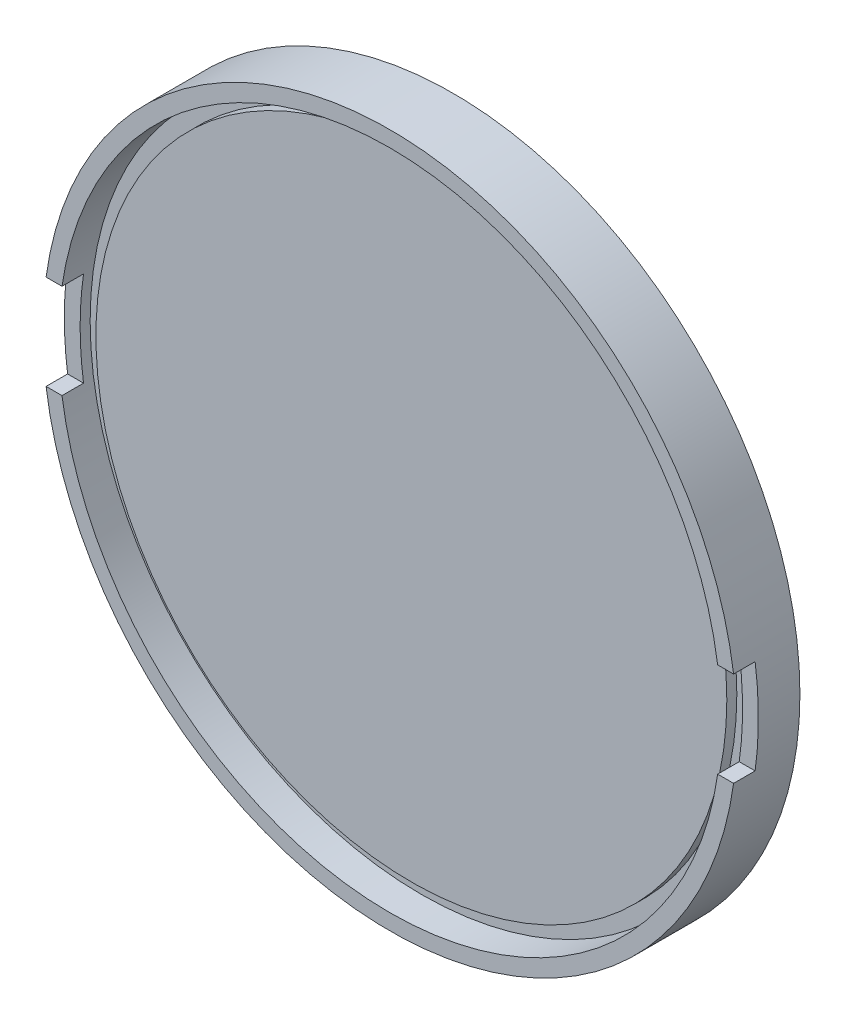
ISO-10303-21;
HEADER;
FILE_DESCRIPTION(('STEP AP214'),'2;1');
FILE_NAME('part.step','',(''),(''),'','','');
FILE_SCHEMA(('AUTOMOTIVE_DESIGN { 1 0 10303 214 1 1 1 1 }'));
ENDSEC;
DATA;
#1=APPLICATION_CONTEXT('core data for automotive mechanical design processes');
#2=APPLICATION_PROTOCOL_DEFINITION('international standard','automotive_design',2000,#1);
#3=PRODUCT_CONTEXT('',#1,'mechanical');
#4=PRODUCT('Part','Part','',(#3));
#5=PRODUCT_RELATED_PRODUCT_CATEGORY('part','',(#4));
#6=PRODUCT_DEFINITION_FORMATION('','',#4);
#7=PRODUCT_DEFINITION_CONTEXT('part definition',#1,'design');
#8=PRODUCT_DEFINITION('design','',#6,#7);
#9=PRODUCT_DEFINITION_SHAPE('','',#8);
#10=(LENGTH_UNIT() NAMED_UNIT(*) SI_UNIT(.MILLI.,.METRE.));
#11=(NAMED_UNIT(*) PLANE_ANGLE_UNIT() SI_UNIT($,.RADIAN.));
#12=(NAMED_UNIT(*) SI_UNIT($,.STERADIAN.) SOLID_ANGLE_UNIT());
#13=UNCERTAINTY_MEASURE_WITH_UNIT(LENGTH_MEASURE(1.E-05),#10,'distance_accuracy_value','');
#14=(GEOMETRIC_REPRESENTATION_CONTEXT(3) GLOBAL_UNCERTAINTY_ASSIGNED_CONTEXT((#13)) GLOBAL_UNIT_ASSIGNED_CONTEXT((#10,
#11,#12)) REPRESENTATION_CONTEXT('',''));
#15=CARTESIAN_POINT('',(0.,0.,0.));
#16=DIRECTION('',(0.,0.,1.));
#17=DIRECTION('',(1.,0.,0.));
#18=AXIS2_PLACEMENT_3D('',#15,#16,#17);
#19=CARTESIAN_POINT('',(0.,0.,10.));
#20=DIRECTION('',(0.,0.,-1.));
#21=DIRECTION('',(-1.,0.,0.));
#22=AXIS2_PLACEMENT_3D('',#19,#20,#21);
#23=PLANE('',#22);
#24=DIRECTION('',(1.,0.,0.));
#25=VECTOR('',#24,1.);
#26=CARTESIAN_POINT('',(-110.,-15.,10.));
#27=LINE('',#26,#25);
#28=CARTESIAN_POINT('',(-108.972473588517,-15.,10.));
#29=VERTEX_POINT('',#28);
#30=CARTESIAN_POINT('',(-103.923048454133,-15.,10.));
#31=VERTEX_POINT('',#30);
#32=EDGE_CURVE('E81',#29,#31,#27,.T.);
#33=ORIENTED_EDGE('',*,*,#32,.F.);
#34=CARTESIAN_POINT('',(0.,0.,10.));
#35=DIRECTION('',(0.,0.,-1.));
#36=DIRECTION('',(-1.,0.,0.));
#37=AXIS2_PLACEMENT_3D('',#34,#35,#36);
#38=CIRCLE('',#37,110.);
#39=CARTESIAN_POINT('',(108.972473588517,-15.,10.));
#40=VERTEX_POINT('',#39);
#41=EDGE_CURVE('E149',#40,#29,#38,.T.);
#42=ORIENTED_EDGE('',*,*,#41,.F.);
#43=CARTESIAN_POINT('',(103.923048454133,-15.,10.));
#44=VERTEX_POINT('',#43);
#45=EDGE_CURVE('E213',#44,#40,#27,.T.);
#46=ORIENTED_EDGE('',*,*,#45,.F.);
#47=CARTESIAN_POINT('',(0.,0.,10.));
#48=DIRECTION('',(0.,0.,-1.));
#49=DIRECTION('',(-1.,0.,0.));
#50=AXIS2_PLACEMENT_3D('',#47,#48,#49);
#51=CIRCLE('',#50,105.);
#52=EDGE_CURVE('E177',#44,#31,#51,.T.);
#53=ORIENTED_EDGE('',*,*,#52,.T.);
#54=EDGE_LOOP('',(#33,#42,#46,#53));
#55=FACE_BOUND('',#54,.T.);
#56=ADVANCED_FACE('F57',(#55),#23,.F.);
#57=CARTESIAN_POINT('',(0.,0.,10.));
#58=DIRECTION('',(0.,0.,-1.));
#59=DIRECTION('',(-1.,0.,0.));
#60=AXIS2_PLACEMENT_3D('',#57,#58,#59);
#61=CYLINDRICAL_SURFACE('',#60,110.);
#62=CARTESIAN_POINT('',(0.,0.,3.17499999999999));
#63=DIRECTION('',(0.,0.,-1.));
#64=DIRECTION('',(-1.,0.,0.));
#65=AXIS2_PLACEMENT_3D('',#62,#63,#64);
#66=CIRCLE('',#65,110.);
#67=CARTESIAN_POINT('',(108.972473588517,-15.,3.17499999999999));
#68=VERTEX_POINT('',#67);
#69=CARTESIAN_POINT('',(108.972473588517,15.,3.17499999999999));
#70=VERTEX_POINT('',#69);
#71=EDGE_CURVE('E135',#68,#70,#66,.F.);
#72=ORIENTED_EDGE('',*,*,#71,.F.);
#73=DIRECTION('',(0.,0.,-1.));
#74=VECTOR('',#73,1.);
#75=CARTESIAN_POINT('',(108.972473588517,-15.,10.));
#76=LINE('',#75,#74);
#77=EDGE_CURVE('E136',#68,#40,#76,.F.);
#78=ORIENTED_EDGE('',*,*,#77,.T.);
#79=ORIENTED_EDGE('',*,*,#41,.T.);
#80=DIRECTION('',(0.,0.,-1.));
#81=VECTOR('',#80,1.);
#82=CARTESIAN_POINT('',(-108.972473588517,-15.,10.));
#83=LINE('',#82,#81);
#84=CARTESIAN_POINT('',(-108.972473588517,-15.,3.17499999999999));
#85=VERTEX_POINT('',#84);
#86=EDGE_CURVE('E139',#29,#85,#83,.T.);
#87=ORIENTED_EDGE('',*,*,#86,.T.);
#88=CARTESIAN_POINT('',(-108.972473588517,15.,3.17499999999999));
#89=VERTEX_POINT('',#88);
#90=EDGE_CURVE('E123',#89,#85,#66,.F.);
#91=ORIENTED_EDGE('',*,*,#90,.F.);
#92=DIRECTION('',(0.,0.,-1.));
#93=VECTOR('',#92,1.);
#94=CARTESIAN_POINT('',(-108.972473588517,15.,10.));
#95=LINE('',#94,#93);
#96=CARTESIAN_POINT('',(-108.972473588517,15.,10.));
#97=VERTEX_POINT('',#96);
#98=EDGE_CURVE('E162',#97,#89,#95,.T.);
#99=ORIENTED_EDGE('',*,*,#98,.F.);
#100=CARTESIAN_POINT('',(108.972473588517,15.,10.));
#101=VERTEX_POINT('',#100);
#102=EDGE_CURVE('E183',#97,#101,#38,.T.);
#103=ORIENTED_EDGE('',*,*,#102,.T.);
#104=DIRECTION('',(0.,0.,-1.));
#105=VECTOR('',#104,1.);
#106=CARTESIAN_POINT('',(108.972473588517,15.,10.));
#107=LINE('',#106,#105);
#108=EDGE_CURVE('E165',#70,#101,#107,.F.);
#109=ORIENTED_EDGE('',*,*,#108,.F.);
#110=EDGE_LOOP('',(#72,#78,#79,#87,#91,#99,#103,#109));
#111=FACE_BOUND('',#110,.T.);
#112=CARTESIAN_POINT('',(0.,0.,-10.));
#113=DIRECTION('',(0.,0.,-1.));
#114=DIRECTION('',(-1.,0.,0.));
#115=AXIS2_PLACEMENT_3D('',#112,#113,#114);
#116=CIRCLE('',#115,110.);
#117=CARTESIAN_POINT('',(-110.,0.,-10.));
#118=VERTEX_POINT('',#117);
#119=EDGE_CURVE('E168',#118,#118,#116,.T.);
#120=ORIENTED_EDGE('',*,*,#119,.F.);
#121=EDGE_LOOP('',(#120));
#122=FACE_BOUND('',#121,.T.);
#123=ADVANCED_FACE('F59',(#111,#122),#61,.T.);
#124=ORIENTED_EDGE('',*,*,#102,.F.);
#125=DIRECTION('',(1.,0.,0.));
#126=VECTOR('',#125,1.);
#127=CARTESIAN_POINT('',(-110.,15.,10.));
#128=LINE('',#127,#126);
#129=CARTESIAN_POINT('',(-103.923048454133,15.,10.));
#130=VERTEX_POINT('',#129);
#131=EDGE_CURVE('E151',#97,#130,#128,.T.);
#132=ORIENTED_EDGE('',*,*,#131,.T.);
#133=CARTESIAN_POINT('',(103.923048454133,15.,10.));
#134=VERTEX_POINT('',#133);
#135=EDGE_CURVE('E173',#130,#134,#51,.T.);
#136=ORIENTED_EDGE('',*,*,#135,.T.);
#137=EDGE_CURVE('E157',#134,#101,#128,.T.);
#138=ORIENTED_EDGE('',*,*,#137,.T.);
#139=EDGE_LOOP('',(#124,#132,#136,#138));
#140=FACE_BOUND('',#139,.T.);
#141=ADVANCED_FACE('F225',(#140),#23,.F.);
#142=CARTESIAN_POINT('',(0.,0.,10.));
#143=DIRECTION('',(0.,0.,-1.));
#144=DIRECTION('',(-1.,0.,0.));
#145=AXIS2_PLACEMENT_3D('',#142,#143,#144);
#146=CYLINDRICAL_SURFACE('',#145,105.);
#147=CARTESIAN_POINT('',(0.,0.,3.17499999999999));
#148=DIRECTION('',(0.,0.,-1.));
#149=DIRECTION('',(-1.,0.,0.));
#150=AXIS2_PLACEMENT_3D('',#147,#148,#149);
#151=CIRCLE('',#150,105.);
#152=CARTESIAN_POINT('',(103.923048454133,-15.,3.17499999999999));
#153=VERTEX_POINT('',#152);
#154=CARTESIAN_POINT('',(103.923048454133,15.,3.17499999999999));
#155=VERTEX_POINT('',#154);
#156=EDGE_CURVE('E66',#153,#155,#151,.F.);
#157=ORIENTED_EDGE('',*,*,#156,.T.);
#158=DIRECTION('',(0.,0.,-1.));
#159=VECTOR('',#158,1.);
#160=CARTESIAN_POINT('',(103.923048454133,15.,10.));
#161=LINE('',#160,#159);
#162=EDGE_CURVE('E12',#155,#134,#161,.F.);
#163=ORIENTED_EDGE('',*,*,#162,.T.);
#164=ORIENTED_EDGE('',*,*,#135,.F.);
#165=DIRECTION('',(0.,0.,-1.));
#166=VECTOR('',#165,1.);
#167=CARTESIAN_POINT('',(-103.923048454133,15.,10.));
#168=LINE('',#167,#166);
#169=CARTESIAN_POINT('',(-103.923048454133,15.,3.17499999999999));
#170=VERTEX_POINT('',#169);
#171=EDGE_CURVE('E189',#130,#170,#168,.T.);
#172=ORIENTED_EDGE('',*,*,#171,.T.);
#173=CARTESIAN_POINT('',(-103.923048454133,-15.,3.17499999999999));
#174=VERTEX_POINT('',#173);
#175=EDGE_CURVE('E186',#170,#174,#151,.F.);
#176=ORIENTED_EDGE('',*,*,#175,.T.);
#177=DIRECTION('',(0.,0.,-1.));
#178=VECTOR('',#177,1.);
#179=CARTESIAN_POINT('',(-103.923048454133,-15.,10.));
#180=LINE('',#179,#178);
#181=EDGE_CURVE('E140',#31,#174,#180,.T.);
#182=ORIENTED_EDGE('',*,*,#181,.F.);
#183=ORIENTED_EDGE('',*,*,#52,.F.);
#184=DIRECTION('',(0.,0.,-1.));
#185=VECTOR('',#184,1.);
#186=CARTESIAN_POINT('',(103.923048454133,-15.,10.));
#187=LINE('',#186,#185);
#188=EDGE_CURVE('E192',#153,#44,#187,.F.);
#189=ORIENTED_EDGE('',*,*,#188,.F.);
#190=EDGE_LOOP('',(#157,#163,#164,#172,#176,#182,#183,#189));
#191=FACE_BOUND('',#190,.T.);
#192=CARTESIAN_POINT('',(0.,0.,0.));
#193=DIRECTION('',(0.,0.,-1.));
#194=DIRECTION('',(-1.,0.,0.));
#195=AXIS2_PLACEMENT_3D('',#192,#193,#194);
#196=CIRCLE('',#195,105.);
#197=CARTESIAN_POINT('',(-105.,0.,0.));
#198=VERTEX_POINT('',#197);
#199=EDGE_CURVE('E172',#198,#198,#196,.T.);
#200=ORIENTED_EDGE('',*,*,#199,.T.);
#201=EDGE_LOOP('',(#200));
#202=FACE_BOUND('',#201,.T.);
#203=ADVANCED_FACE('F199',(#191,#202),#146,.F.);
#204=CARTESIAN_POINT('',(0.,0.,0.));
#205=DIRECTION('',(0.,0.,-1.));
#206=DIRECTION('',(-1.,0.,0.));
#207=AXIS2_PLACEMENT_3D('',#204,#205,#206);
#208=PLANE('',#207);
#209=ORIENTED_EDGE('',*,*,#199,.F.);
#210=EDGE_LOOP('',(#209));
#211=FACE_BOUND('',#210,.T.);
#212=ADVANCED_FACE('F248',(#211),#208,.F.);
#213=CARTESIAN_POINT('',(0.,0.,-10.));
#214=DIRECTION('',(0.,0.,-1.));
#215=DIRECTION('',(-1.,0.,0.));
#216=AXIS2_PLACEMENT_3D('',#213,#214,#215);
#217=PLANE('',#216);
#218=ORIENTED_EDGE('',*,*,#119,.T.);
#219=EDGE_LOOP('',(#218));
#220=FACE_BOUND('',#219,.T.);
#221=ADVANCED_FACE('F253',(#220),#217,.T.);
#222=CARTESIAN_POINT('',(-110.,-15.,3.17499999999999));
#223=DIRECTION('',(0.,1.,0.));
#224=DIRECTION('',(0.,0.,1.));
#225=AXIS2_PLACEMENT_3D('',#222,#223,#224);
#226=PLANE('',#225);
#227=ORIENTED_EDGE('',*,*,#32,.T.);
#228=ORIENTED_EDGE('',*,*,#181,.T.);
#229=DIRECTION('',(1.,0.,0.));
#230=VECTOR('',#229,1.);
#231=CARTESIAN_POINT('',(-110.,-15.,3.17499999999999));
#232=LINE('',#231,#230);
#233=EDGE_CURVE('E126',#85,#174,#232,.T.);
#234=ORIENTED_EDGE('',*,*,#233,.F.);
#235=ORIENTED_EDGE('',*,*,#86,.F.);
#236=EDGE_LOOP('',(#227,#228,#234,#235));
#237=FACE_BOUND('',#236,.T.);
#238=ADVANCED_FACE('F138',(#237),#226,.T.);
#239=CARTESIAN_POINT('',(-110.,-15.,3.17499999999999));
#240=DIRECTION('',(0.,0.,-1.));
#241=DIRECTION('',(-1.,0.,0.));
#242=AXIS2_PLACEMENT_3D('',#239,#240,#241);
#243=PLANE('',#242);
#244=ORIENTED_EDGE('',*,*,#90,.T.);
#245=ORIENTED_EDGE('',*,*,#233,.T.);
#246=ORIENTED_EDGE('',*,*,#175,.F.);
#247=DIRECTION('',(1.,0.,0.));
#248=VECTOR('',#247,1.);
#249=CARTESIAN_POINT('',(-110.,15.,3.17499999999999));
#250=LINE('',#249,#248);
#251=EDGE_CURVE('E129',#89,#170,#250,.T.);
#252=ORIENTED_EDGE('',*,*,#251,.F.);
#253=EDGE_LOOP('',(#244,#245,#246,#252));
#254=FACE_BOUND('',#253,.T.);
#255=ADVANCED_FACE('F125',(#254),#243,.F.);
#256=CARTESIAN_POINT('',(-110.,15.,3.17499999999999));
#257=DIRECTION('',(0.,1.,0.));
#258=DIRECTION('',(0.,0.,1.));
#259=AXIS2_PLACEMENT_3D('',#256,#257,#258);
#260=PLANE('',#259);
#261=ORIENTED_EDGE('',*,*,#98,.T.);
#262=ORIENTED_EDGE('',*,*,#251,.T.);
#263=ORIENTED_EDGE('',*,*,#171,.F.);
#264=ORIENTED_EDGE('',*,*,#131,.F.);
#265=EDGE_LOOP('',(#261,#262,#263,#264));
#266=FACE_BOUND('',#265,.T.);
#267=ADVANCED_FACE('F229',(#266),#260,.F.);
#268=ORIENTED_EDGE('',*,*,#108,.T.);
#269=ORIENTED_EDGE('',*,*,#137,.F.);
#270=ORIENTED_EDGE('',*,*,#162,.F.);
#271=EDGE_CURVE('E142',#155,#70,#250,.T.);
#272=ORIENTED_EDGE('',*,*,#271,.T.);
#273=EDGE_LOOP('',(#268,#269,#270,#272));
#274=FACE_BOUND('',#273,.T.);
#275=ADVANCED_FACE('F227',(#274),#260,.F.);
#276=ORIENTED_EDGE('',*,*,#71,.T.);
#277=ORIENTED_EDGE('',*,*,#271,.F.);
#278=ORIENTED_EDGE('',*,*,#156,.F.);
#279=EDGE_CURVE('E73',#153,#68,#232,.T.);
#280=ORIENTED_EDGE('',*,*,#279,.T.);
#281=EDGE_LOOP('',(#276,#277,#278,#280));
#282=FACE_BOUND('',#281,.T.);
#283=ADVANCED_FACE('F205',(#282),#243,.F.);
#284=ORIENTED_EDGE('',*,*,#279,.F.);
#285=ORIENTED_EDGE('',*,*,#188,.T.);
#286=ORIENTED_EDGE('',*,*,#45,.T.);
#287=ORIENTED_EDGE('',*,*,#77,.F.);
#288=EDGE_LOOP('',(#284,#285,#286,#287));
#289=FACE_BOUND('',#288,.T.);
#290=ADVANCED_FACE('F216',(#289),#226,.T.);
#291=CLOSED_SHELL('',(#56,#123,#141,#203,#212,#221,#238,#255,#267,#275,#283,#290));
#292=MANIFOLD_SOLID_BREP('B2',#291);
#293=CARTESIAN_POINT('',(0.,0.,3.175));
#294=DIRECTION('',(0.,0.,-1.));
#295=DIRECTION('',(-1.,0.,0.));
#296=AXIS2_PLACEMENT_3D('',#293,#294,#295);
#297=CYLINDRICAL_SURFACE('',#296,100.);
#298=CARTESIAN_POINT('',(0.,0.,3.175));
#299=DIRECTION('',(0.,0.,1.));
#300=DIRECTION('',(1.,0.,0.));
#301=AXIS2_PLACEMENT_3D('',#298,#299,#300);
#302=CIRCLE('',#301,100.);
#303=CARTESIAN_POINT('',(100.,0.,3.175));
#304=VERTEX_POINT('',#303);
#305=EDGE_CURVE('E56',#304,#304,#302,.T.);
#306=ORIENTED_EDGE('',*,*,#305,.F.);
#307=EDGE_LOOP('',(#306));
#308=FACE_BOUND('',#307,.T.);
#309=CARTESIAN_POINT('',(0.,0.,0.));
#310=DIRECTION('',(0.,0.,1.));
#311=DIRECTION('',(1.,0.,0.));
#312=AXIS2_PLACEMENT_3D('',#309,#310,#311);
#313=CIRCLE('',#312,100.);
#314=CARTESIAN_POINT('',(100.,0.,0.));
#315=VERTEX_POINT('',#314);
#316=EDGE_CURVE('E335',#315,#315,#313,.T.);
#317=ORIENTED_EDGE('',*,*,#316,.T.);
#318=EDGE_LOOP('',(#317));
#319=FACE_BOUND('',#318,.T.);
#320=ADVANCED_FACE('F332',(#308,#319),#297,.T.);
#321=CARTESIAN_POINT('',(0.,0.,3.175));
#322=DIRECTION('',(0.,0.,1.));
#323=DIRECTION('',(1.,0.,0.));
#324=AXIS2_PLACEMENT_3D('',#321,#322,#323);
#325=PLANE('',#324);
#326=ORIENTED_EDGE('',*,*,#305,.T.);
#327=EDGE_LOOP('',(#326));
#328=FACE_BOUND('',#327,.T.);
#329=ADVANCED_FACE('F347',(#328),#325,.T.);
#330=CARTESIAN_POINT('',(0.,0.,0.));
#331=DIRECTION('',(0.,0.,1.));
#332=DIRECTION('',(1.,0.,0.));
#333=AXIS2_PLACEMENT_3D('',#330,#331,#332);
#334=PLANE('',#333);
#335=ORIENTED_EDGE('',*,*,#316,.F.);
#336=EDGE_LOOP('',(#335));
#337=FACE_BOUND('',#336,.T.);
#338=ADVANCED_FACE('F345',(#337),#334,.F.);
#339=CLOSED_SHELL('',(#320,#329,#338));
#340=MANIFOLD_SOLID_BREP('B6',#339);
#341=ADVANCED_BREP_SHAPE_REPRESENTATION('',(#18,#292,#340),#14);
#342=SHAPE_DEFINITION_REPRESENTATION(#9,#341);
ENDSEC;
END-ISO-10303-21;
